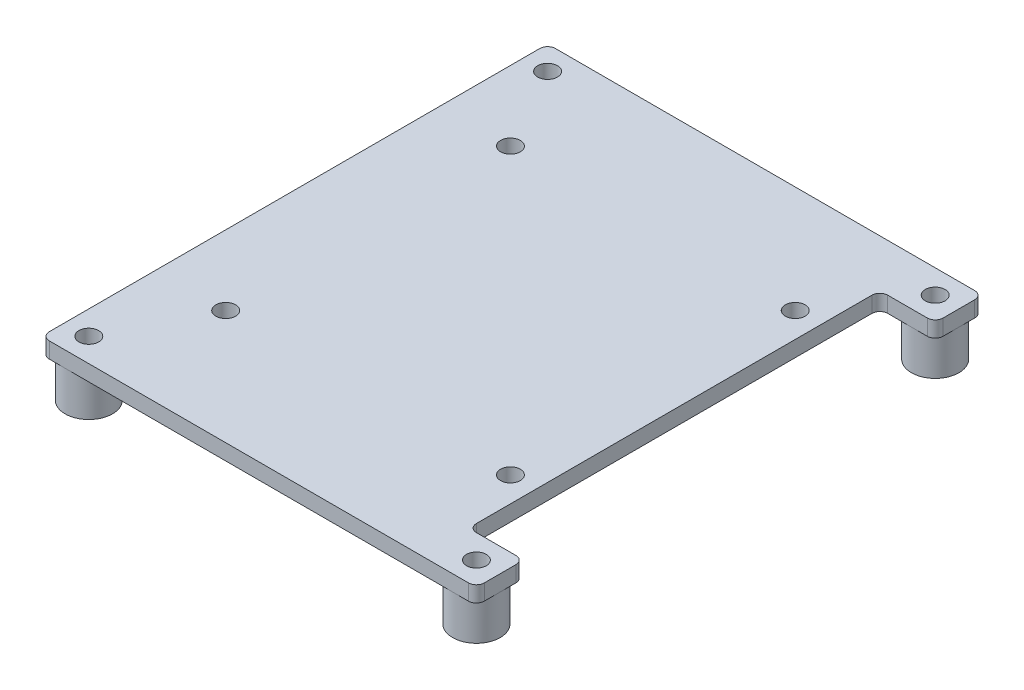
ISO-10303-21;
HEADER;
FILE_DESCRIPTION(('STEP AP214'),'2;1');
FILE_NAME('part.step','',(''),(''),'','','');
FILE_SCHEMA(('AUTOMOTIVE_DESIGN { 1 0 10303 214 1 1 1 1 }'));
ENDSEC;
DATA;
#1=APPLICATION_CONTEXT('core data for automotive mechanical design processes');
#2=APPLICATION_PROTOCOL_DEFINITION('international standard','automotive_design',2000,#1);
#3=PRODUCT_CONTEXT('',#1,'mechanical');
#4=PRODUCT('Part','Part','',(#3));
#5=PRODUCT_RELATED_PRODUCT_CATEGORY('part','',(#4));
#6=PRODUCT_DEFINITION_FORMATION('','',#4);
#7=PRODUCT_DEFINITION_CONTEXT('part definition',#1,'design');
#8=PRODUCT_DEFINITION('design','',#6,#7);
#9=PRODUCT_DEFINITION_SHAPE('','',#8);
#10=(LENGTH_UNIT() NAMED_UNIT(*) SI_UNIT(.MILLI.,.METRE.));
#11=(NAMED_UNIT(*) PLANE_ANGLE_UNIT() SI_UNIT($,.RADIAN.));
#12=(NAMED_UNIT(*) SI_UNIT($,.STERADIAN.) SOLID_ANGLE_UNIT());
#13=UNCERTAINTY_MEASURE_WITH_UNIT(LENGTH_MEASURE(1.E-05),#10,'distance_accuracy_value','');
#14=(GEOMETRIC_REPRESENTATION_CONTEXT(3) GLOBAL_UNCERTAINTY_ASSIGNED_CONTEXT((#13)) GLOBAL_UNIT_ASSIGNED_CONTEXT((#10,
#11,#12)) REPRESENTATION_CONTEXT('',''));
#15=CARTESIAN_POINT('',(0.,0.,0.));
#16=DIRECTION('',(0.,0.,1.));
#17=DIRECTION('',(1.,0.,0.));
#18=AXIS2_PLACEMENT_3D('',#15,#16,#17);
#19=CARTESIAN_POINT('',(0.,0.,0.));
#20=DIRECTION('',(0.,1.,0.));
#21=DIRECTION('',(0.,0.,1.));
#22=AXIS2_PLACEMENT_3D('',#19,#20,#21);
#23=PLANE('',#22);
#24=CARTESIAN_POINT('',(0.,0.,0.));
#25=DIRECTION('',(0.,1.,0.));
#26=DIRECTION('',(0.,0.,1.));
#27=AXIS2_PLACEMENT_3D('',#24,#25,#26);
#28=CIRCLE('',#27,1.249934);
#29=CARTESIAN_POINT('',(0.,0.,1.249934));
#30=VERTEX_POINT('',#29);
#31=EDGE_CURVE('E236',#30,#30,#28,.T.);
#32=ORIENTED_EDGE('',*,*,#31,.T.);
#33=EDGE_LOOP('',(#32));
#34=FACE_BOUND('',#33,.T.);
#35=CARTESIAN_POINT('',(35.999928,0.,0.));
#36=DIRECTION('',(0.,1.,0.));
#37=DIRECTION('',(0.,0.,1.));
#38=AXIS2_PLACEMENT_3D('',#35,#36,#37);
#39=CIRCLE('',#38,1.24993399999999);
#40=CARTESIAN_POINT('',(35.999928,0.,1.249934));
#41=VERTEX_POINT('',#40);
#42=EDGE_CURVE('E232',#41,#41,#39,.T.);
#43=ORIENTED_EDGE('',*,*,#42,.T.);
#44=EDGE_LOOP('',(#43));
#45=FACE_BOUND('',#44,.T.);
#46=CARTESIAN_POINT('',(0.,0.,35.999927999998));
#47=DIRECTION('',(0.,1.,0.));
#48=DIRECTION('',(0.,0.,1.));
#49=AXIS2_PLACEMENT_3D('',#46,#47,#48);
#50=CIRCLE('',#49,1.249934);
#51=CARTESIAN_POINT('',(0.,0.,37.249861999998));
#52=VERTEX_POINT('',#51);
#53=EDGE_CURVE('E228',#52,#52,#50,.T.);
#54=ORIENTED_EDGE('',*,*,#53,.T.);
#55=EDGE_LOOP('',(#54));
#56=FACE_BOUND('',#55,.T.);
#57=CARTESIAN_POINT('',(35.999928,0.,35.999927999998));
#58=DIRECTION('',(0.,1.,0.));
#59=DIRECTION('',(0.,0.,1.));
#60=AXIS2_PLACEMENT_3D('',#57,#58,#59);
#61=CIRCLE('',#60,1.249934);
#62=CARTESIAN_POINT('',(35.999928,0.,37.249861999998));
#63=VERTEX_POINT('',#62);
#64=EDGE_CURVE('E224',#63,#63,#61,.T.);
#65=ORIENTED_EDGE('',*,*,#64,.T.);
#66=EDGE_LOOP('',(#65));
#67=FACE_BOUND('',#66,.T.);
#68=DIRECTION('',(1.,0.,0.));
#69=VECTOR('',#68,1.);
#70=CARTESIAN_POINT('',(0.,0.,50.4711806944633));
#71=LINE('',#70,#69);
#72=CARTESIAN_POINT('',(-5.83017013155008,0.,50.4711806944633));
#73=VERTEX_POINT('',#72);
#74=CARTESIAN_POINT('',(43.1698298684499,0.,50.4711806944633));
#75=VERTEX_POINT('',#74);
#76=EDGE_CURVE('E62',#73,#75,#71,.T.);
#77=ORIENTED_EDGE('',*,*,#76,.F.);
#78=CARTESIAN_POINT('',(-5.83017013155008,0.,47.4711806944633));
#79=DIRECTION('',(0.,1.,0.));
#80=DIRECTION('',(0.,0.,1.));
#81=AXIS2_PLACEMENT_3D('',#78,#79,#80);
#82=CIRCLE('',#81,2.99999999999999);
#83=CARTESIAN_POINT('',(-8.83017013155007,0.,47.4711806944633));
#84=VERTEX_POINT('',#83);
#85=EDGE_CURVE('E11',#73,#84,#82,.T.);
#86=ORIENTED_EDGE('',*,*,#85,.T.);
#87=DIRECTION('',(0.,0.,1.));
#88=VECTOR('',#87,1.);
#89=CARTESIAN_POINT('',(-8.83017013155007,0.,0.));
#90=LINE('',#89,#88);
#91=CARTESIAN_POINT('',(-8.83017013155007,0.,-10.5288193055367));
#92=VERTEX_POINT('',#91);
#93=EDGE_CURVE('E191',#92,#84,#90,.T.);
#94=ORIENTED_EDGE('',*,*,#93,.F.);
#95=CARTESIAN_POINT('',(-5.83017013155007,0.,-10.5288193055367));
#96=DIRECTION('',(0.,1.,0.));
#97=DIRECTION('',(0.,0.,1.));
#98=AXIS2_PLACEMENT_3D('',#95,#96,#97);
#99=CIRCLE('',#98,3.);
#100=CARTESIAN_POINT('',(-5.83017013155007,0.,-13.5288193055367));
#101=VERTEX_POINT('',#100);
#102=EDGE_CURVE('E353',#92,#101,#99,.T.);
#103=ORIENTED_EDGE('',*,*,#102,.T.);
#104=DIRECTION('',(1.,0.,0.));
#105=VECTOR('',#104,1.);
#106=CARTESIAN_POINT('',(0.,0.,-13.5288193055367));
#107=LINE('',#106,#105);
#108=CARTESIAN_POINT('',(43.1698298684499,0.,-13.5288193055367));
#109=VERTEX_POINT('',#108);
#110=EDGE_CURVE('E536',#101,#109,#107,.T.);
#111=ORIENTED_EDGE('',*,*,#110,.T.);
#112=CARTESIAN_POINT('',(43.1698298684499,0.,-10.5288193055367));
#113=DIRECTION('',(0.,1.,0.));
#114=DIRECTION('',(0.,0.,1.));
#115=AXIS2_PLACEMENT_3D('',#112,#113,#114);
#116=CIRCLE('',#115,3.);
#117=CARTESIAN_POINT('',(43.1698298684499,0.,-7.52881930553675));
#118=VERTEX_POINT('',#117);
#119=EDGE_CURVE('E625',#109,#118,#116,.T.);
#120=ORIENTED_EDGE('',*,*,#119,.T.);
#121=DIRECTION('',(-1.,0.,0.));
#122=VECTOR('',#121,1.);
#123=CARTESIAN_POINT('',(46.1698298684499,0.,-7.52881930553675));
#124=LINE('',#123,#122);
#125=CARTESIAN_POINT('',(40.1698298684499,0.,-7.52881930553674));
#126=VERTEX_POINT('',#125);
#127=EDGE_CURVE('E551',#118,#126,#124,.T.);
#128=ORIENTED_EDGE('',*,*,#127,.T.);
#129=CARTESIAN_POINT('',(40.1698298684499,0.,-6.52881930553674));
#130=DIRECTION('',(0.,1.,0.));
#131=DIRECTION('',(0.,0.,1.));
#132=AXIS2_PLACEMENT_3D('',#129,#130,#131);
#133=CIRCLE('',#132,1.);
#134=CARTESIAN_POINT('',(39.1698298684499,0.,-6.52881930553674));
#135=VERTEX_POINT('',#134);
#136=EDGE_CURVE('E351',#126,#135,#133,.T.);
#137=ORIENTED_EDGE('',*,*,#136,.T.);
#138=DIRECTION('',(0.,0.,1.));
#139=VECTOR('',#138,1.);
#140=CARTESIAN_POINT('',(39.1698298684499,0.,-7.52881930553674));
#141=LINE('',#140,#139);
#142=CARTESIAN_POINT('',(39.1698298684499,0.,43.4711806944633));
#143=VERTEX_POINT('',#142);
#144=EDGE_CURVE('E527',#135,#143,#141,.T.);
#145=ORIENTED_EDGE('',*,*,#144,.T.);
#146=CARTESIAN_POINT('',(40.1698298684499,0.,43.4711806944633));
#147=DIRECTION('',(0.,1.,0.));
#148=DIRECTION('',(0.,0.,1.));
#149=AXIS2_PLACEMENT_3D('',#146,#147,#148);
#150=CIRCLE('',#149,1.);
#151=CARTESIAN_POINT('',(40.1698298684499,0.,44.4711806944633));
#152=VERTEX_POINT('',#151);
#153=EDGE_CURVE('E344',#143,#152,#150,.T.);
#154=ORIENTED_EDGE('',*,*,#153,.T.);
#155=DIRECTION('',(1.,0.,0.));
#156=VECTOR('',#155,1.);
#157=CARTESIAN_POINT('',(46.1698298684499,0.,44.4711806944633));
#158=LINE('',#157,#156);
#159=CARTESIAN_POINT('',(43.1698298684499,0.,44.4711806944633));
#160=VERTEX_POINT('',#159);
#161=EDGE_CURVE('E525',#152,#160,#158,.T.);
#162=ORIENTED_EDGE('',*,*,#161,.T.);
#163=CARTESIAN_POINT('',(43.1698298684499,0.,47.4711806944633));
#164=DIRECTION('',(0.,1.,0.));
#165=DIRECTION('',(0.,0.,1.));
#166=AXIS2_PLACEMENT_3D('',#163,#164,#165);
#167=CIRCLE('',#166,2.99999999999999);
#168=EDGE_CURVE('E607',#160,#75,#167,.T.);
#169=ORIENTED_EDGE('',*,*,#168,.T.);
#170=EDGE_LOOP('',(#77,#86,#94,#103,#111,#120,#128,#137,#145,#154,#162,#169));
#171=FACE_BOUND('',#170,.T.);
#172=ADVANCED_FACE('F41',(#34,#45,#56,#67,#171),#23,.F.);
#173=CARTESIAN_POINT('',(45.1698298684499,0.,50.4711806944633));
#174=VERTEX_POINT('',#173);
#175=EDGE_CURVE('E210',#75,#174,#71,.T.);
#176=ORIENTED_EDGE('',*,*,#175,.F.);
#177=CARTESIAN_POINT('',(46.1698298684499,0.,47.4711806944633));
#178=VERTEX_POINT('',#177);
#179=EDGE_CURVE('E438',#75,#178,#167,.T.);
#180=ORIENTED_EDGE('',*,*,#179,.T.);
#181=DIRECTION('',(0.,0.,1.));
#182=VECTOR('',#181,1.);
#183=CARTESIAN_POINT('',(46.1698298684499,0.,0.));
#184=LINE('',#183,#182);
#185=CARTESIAN_POINT('',(46.1698298684499,0.,49.4711806944633));
#186=VERTEX_POINT('',#185);
#187=EDGE_CURVE('E217',#178,#186,#184,.T.);
#188=ORIENTED_EDGE('',*,*,#187,.T.);
#189=CARTESIAN_POINT('',(45.1698298684499,0.,49.4711806944633));
#190=DIRECTION('',(0.,1.,0.));
#191=DIRECTION('',(0.,0.,1.));
#192=AXIS2_PLACEMENT_3D('',#189,#190,#191);
#193=CIRCLE('',#192,1.);
#194=EDGE_CURVE('E282',#186,#174,#193,.F.);
#195=ORIENTED_EDGE('',*,*,#194,.T.);
#196=EDGE_LOOP('',(#176,#180,#188,#195));
#197=FACE_BOUND('',#196,.T.);
#198=ADVANCED_FACE('F381',(#197),#23,.F.);
#199=CARTESIAN_POINT('',(46.1698298684499,0.,45.4711806944633));
#200=VERTEX_POINT('',#199);
#201=EDGE_CURVE('E218',#200,#178,#184,.T.);
#202=ORIENTED_EDGE('',*,*,#201,.T.);
#203=EDGE_CURVE('E616',#178,#160,#167,.T.);
#204=ORIENTED_EDGE('',*,*,#203,.T.);
#205=CARTESIAN_POINT('',(45.1698298684499,0.,44.4711806944633));
#206=VERTEX_POINT('',#205);
#207=EDGE_CURVE('E530',#160,#206,#158,.T.);
#208=ORIENTED_EDGE('',*,*,#207,.T.);
#209=CARTESIAN_POINT('',(45.1698298684499,0.,45.4711806944633));
#210=DIRECTION('',(0.,1.,0.));
#211=DIRECTION('',(0.,0.,1.));
#212=AXIS2_PLACEMENT_3D('',#209,#210,#211);
#213=CIRCLE('',#212,1.);
#214=EDGE_CURVE('E279',#206,#200,#213,.F.);
#215=ORIENTED_EDGE('',*,*,#214,.T.);
#216=EDGE_LOOP('',(#202,#204,#208,#215));
#217=FACE_BOUND('',#216,.T.);
#218=ADVANCED_FACE('F387',(#217),#23,.F.);
#219=CARTESIAN_POINT('',(45.1698298684499,0.,-7.52881930553675));
#220=VERTEX_POINT('',#219);
#221=EDGE_CURVE('E635',#220,#118,#124,.T.);
#222=ORIENTED_EDGE('',*,*,#221,.T.);
#223=CARTESIAN_POINT('',(46.1698298684499,0.,-10.5288193055367));
#224=VERTEX_POINT('',#223);
#225=EDGE_CURVE('E629',#118,#224,#116,.T.);
#226=ORIENTED_EDGE('',*,*,#225,.T.);
#227=CARTESIAN_POINT('',(46.1698298684499,0.,-8.52881930553674));
#228=VERTEX_POINT('',#227);
#229=EDGE_CURVE('E222',#224,#228,#184,.T.);
#230=ORIENTED_EDGE('',*,*,#229,.T.);
#231=CARTESIAN_POINT('',(45.1698298684499,0.,-8.52881930553674));
#232=DIRECTION('',(0.,1.,0.));
#233=DIRECTION('',(0.,0.,1.));
#234=AXIS2_PLACEMENT_3D('',#231,#232,#233);
#235=CIRCLE('',#234,1.);
#236=EDGE_CURVE('E294',#228,#220,#235,.F.);
#237=ORIENTED_EDGE('',*,*,#236,.T.);
#238=EDGE_LOOP('',(#222,#226,#230,#237));
#239=FACE_BOUND('',#238,.T.);
#240=ADVANCED_FACE('F414',(#239),#23,.F.);
#241=CARTESIAN_POINT('',(46.1698298684499,0.,-12.5288193055367));
#242=VERTEX_POINT('',#241);
#243=EDGE_CURVE('E223',#242,#224,#184,.T.);
#244=ORIENTED_EDGE('',*,*,#243,.T.);
#245=EDGE_CURVE('E423',#224,#109,#116,.T.);
#246=ORIENTED_EDGE('',*,*,#245,.T.);
#247=CARTESIAN_POINT('',(45.1698298684499,0.,-13.5288193055367));
#248=VERTEX_POINT('',#247);
#249=EDGE_CURVE('E532',#109,#248,#107,.T.);
#250=ORIENTED_EDGE('',*,*,#249,.T.);
#251=CARTESIAN_POINT('',(45.1698298684499,0.,-12.5288193055367));
#252=DIRECTION('',(0.,1.,0.));
#253=DIRECTION('',(0.,0.,1.));
#254=AXIS2_PLACEMENT_3D('',#251,#252,#253);
#255=CIRCLE('',#254,1.);
#256=EDGE_CURVE('E291',#248,#242,#255,.F.);
#257=ORIENTED_EDGE('',*,*,#256,.T.);
#258=EDGE_LOOP('',(#244,#246,#250,#257));
#259=FACE_BOUND('',#258,.T.);
#260=ADVANCED_FACE('F405',(#259),#23,.F.);
#261=CARTESIAN_POINT('',(-7.83017013155007,0.,-13.5288193055367));
#262=VERTEX_POINT('',#261);
#263=EDGE_CURVE('E202',#262,#101,#107,.T.);
#264=ORIENTED_EDGE('',*,*,#263,.T.);
#265=EDGE_CURVE('E186',#101,#92,#99,.T.);
#266=ORIENTED_EDGE('',*,*,#265,.T.);
#267=CARTESIAN_POINT('',(-8.83017013155007,0.,-12.5288193055367));
#268=VERTEX_POINT('',#267);
#269=EDGE_CURVE('E204',#268,#92,#90,.T.);
#270=ORIENTED_EDGE('',*,*,#269,.F.);
#271=CARTESIAN_POINT('',(-7.83017013155007,0.,-12.5288193055367));
#272=DIRECTION('',(0.,1.,0.));
#273=DIRECTION('',(0.,0.,1.));
#274=AXIS2_PLACEMENT_3D('',#271,#272,#273);
#275=CIRCLE('',#274,1.);
#276=EDGE_CURVE('E288',#268,#262,#275,.F.);
#277=ORIENTED_EDGE('',*,*,#276,.T.);
#278=EDGE_LOOP('',(#264,#266,#270,#277));
#279=FACE_BOUND('',#278,.T.);
#280=ADVANCED_FACE('F361',(#279),#23,.F.);
#281=CARTESIAN_POINT('',(46.1698298684499,2.,0.));
#282=DIRECTION('',(1.,0.,0.));
#283=DIRECTION('',(0.,0.,-1.));
#284=AXIS2_PLACEMENT_3D('',#281,#282,#283);
#285=PLANE('',#284);
#286=DIRECTION('',(0.,0.,1.));
#287=VECTOR('',#286,1.);
#288=CARTESIAN_POINT('',(46.1698298684499,2.,0.));
#289=LINE('',#288,#287);
#290=CARTESIAN_POINT('',(46.1698298684499,2.,45.4711806944633));
#291=VERTEX_POINT('',#290);
#292=CARTESIAN_POINT('',(46.1698298684499,2.,49.4711806944633));
#293=VERTEX_POINT('',#292);
#294=EDGE_CURVE('E445',#291,#293,#289,.T.);
#295=ORIENTED_EDGE('',*,*,#294,.T.);
#296=DIRECTION('',(0.,-1.,0.));
#297=VECTOR('',#296,1.);
#298=CARTESIAN_POINT('',(46.1698298684499,0.,49.4711806944633));
#299=LINE('',#298,#297);
#300=EDGE_CURVE('E322',#293,#186,#299,.T.);
#301=ORIENTED_EDGE('',*,*,#300,.T.);
#302=ORIENTED_EDGE('',*,*,#187,.F.);
#303=ORIENTED_EDGE('',*,*,#201,.F.);
#304=DIRECTION('',(0.,1.,0.));
#305=VECTOR('',#304,1.);
#306=CARTESIAN_POINT('',(46.1698298684499,2.,45.4711806944633));
#307=LINE('',#306,#305);
#308=EDGE_CURVE('E318',#200,#291,#307,.T.);
#309=ORIENTED_EDGE('',*,*,#308,.T.);
#310=EDGE_LOOP('',(#295,#301,#302,#303,#309));
#311=FACE_BOUND('',#310,.T.);
#312=ADVANCED_FACE('F404',(#311),#285,.T.);
#313=CARTESIAN_POINT('',(0.,2.,-13.5288193055367));
#314=DIRECTION('',(0.,0.,-1.));
#315=DIRECTION('',(-1.,0.,0.));
#316=AXIS2_PLACEMENT_3D('',#313,#314,#315);
#317=PLANE('',#316);
#318=DIRECTION('',(1.,0.,0.));
#319=VECTOR('',#318,1.);
#320=CARTESIAN_POINT('',(0.,2.,-13.5288193055367));
#321=LINE('',#320,#319);
#322=CARTESIAN_POINT('',(-7.83017013155007,2.,-13.5288193055367));
#323=VERTEX_POINT('',#322);
#324=CARTESIAN_POINT('',(45.1698298684499,2.,-13.5288193055367));
#325=VERTEX_POINT('',#324);
#326=EDGE_CURVE('E567',#323,#325,#321,.T.);
#327=ORIENTED_EDGE('',*,*,#326,.T.);
#328=DIRECTION('',(0.,-1.,0.));
#329=VECTOR('',#328,1.);
#330=CARTESIAN_POINT('',(45.1698298684499,2.,-13.5288193055367));
#331=LINE('',#330,#329);
#332=EDGE_CURVE('E300',#325,#248,#331,.T.);
#333=ORIENTED_EDGE('',*,*,#332,.T.);
#334=ORIENTED_EDGE('',*,*,#249,.F.);
#335=ORIENTED_EDGE('',*,*,#110,.F.);
#336=ORIENTED_EDGE('',*,*,#263,.F.);
#337=DIRECTION('',(0.,-1.,0.));
#338=VECTOR('',#337,1.);
#339=CARTESIAN_POINT('',(-7.83017013155007,2.,-13.5288193055367));
#340=LINE('',#339,#338);
#341=EDGE_CURVE('E297',#262,#323,#340,.F.);
#342=ORIENTED_EDGE('',*,*,#341,.T.);
#343=EDGE_LOOP('',(#327,#333,#334,#335,#336,#342));
#344=FACE_BOUND('',#343,.T.);
#345=ADVANCED_FACE('F410',(#344),#317,.T.);
#346=CARTESIAN_POINT('',(-8.83017013155007,2.,0.));
#347=DIRECTION('',(1.,0.,0.));
#348=DIRECTION('',(0.,0.,-1.));
#349=AXIS2_PLACEMENT_3D('',#346,#347,#348);
#350=PLANE('',#349);
#351=ORIENTED_EDGE('',*,*,#93,.T.);
#352=CARTESIAN_POINT('',(-8.83017013155007,0.,49.4711806944633));
#353=VERTEX_POINT('',#352);
#354=EDGE_CURVE('E195',#84,#353,#90,.T.);
#355=ORIENTED_EDGE('',*,*,#354,.T.);
#356=DIRECTION('',(0.,-1.,0.));
#357=VECTOR('',#356,1.);
#358=CARTESIAN_POINT('',(-8.83017013155007,2.,49.4711806944633));
#359=LINE('',#358,#357);
#360=CARTESIAN_POINT('',(-8.83017013155007,2.,49.4711806944633));
#361=VERTEX_POINT('',#360);
#362=EDGE_CURVE('E304',#353,#361,#359,.F.);
#363=ORIENTED_EDGE('',*,*,#362,.T.);
#364=DIRECTION('',(0.,0.,1.));
#365=VECTOR('',#364,1.);
#366=CARTESIAN_POINT('',(-8.83017013155007,2.,0.));
#367=LINE('',#366,#365);
#368=CARTESIAN_POINT('',(-8.83017013155007,2.,-12.5288193055367));
#369=VERTEX_POINT('',#368);
#370=EDGE_CURVE('E456',#369,#361,#367,.T.);
#371=ORIENTED_EDGE('',*,*,#370,.F.);
#372=DIRECTION('',(0.,-1.,0.));
#373=VECTOR('',#372,1.);
#374=CARTESIAN_POINT('',(-8.83017013155007,0.,-12.5288193055367));
#375=LINE('',#374,#373);
#376=EDGE_CURVE('E307',#369,#268,#375,.T.);
#377=ORIENTED_EDGE('',*,*,#376,.T.);
#378=ORIENTED_EDGE('',*,*,#269,.T.);
#379=EDGE_LOOP('',(#351,#355,#363,#371,#377,#378));
#380=FACE_BOUND('',#379,.T.);
#381=ADVANCED_FACE('F205',(#380),#350,.F.);
#382=CARTESIAN_POINT('',(0.,2.,50.4711806944633));
#383=DIRECTION('',(0.,0.,-1.));
#384=DIRECTION('',(-1.,0.,0.));
#385=AXIS2_PLACEMENT_3D('',#382,#383,#384);
#386=PLANE('',#385);
#387=CARTESIAN_POINT('',(-7.83017013155007,0.,50.4711806944633));
#388=VERTEX_POINT('',#387);
#389=EDGE_CURVE('E214',#388,#73,#71,.T.);
#390=ORIENTED_EDGE('',*,*,#389,.T.);
#391=ORIENTED_EDGE('',*,*,#76,.T.);
#392=ORIENTED_EDGE('',*,*,#175,.T.);
#393=DIRECTION('',(0.,-1.,0.));
#394=VECTOR('',#393,1.);
#395=CARTESIAN_POINT('',(45.1698298684499,2.,50.4711806944633));
#396=LINE('',#395,#394);
#397=CARTESIAN_POINT('',(45.1698298684499,2.,50.4711806944633));
#398=VERTEX_POINT('',#397);
#399=EDGE_CURVE('E310',#174,#398,#396,.F.);
#400=ORIENTED_EDGE('',*,*,#399,.T.);
#401=DIRECTION('',(1.,0.,0.));
#402=VECTOR('',#401,1.);
#403=CARTESIAN_POINT('',(0.,2.,50.4711806944633));
#404=LINE('',#403,#402);
#405=CARTESIAN_POINT('',(-7.83017013155007,2.,50.4711806944633));
#406=VERTEX_POINT('',#405);
#407=EDGE_CURVE('E449',#406,#398,#404,.T.);
#408=ORIENTED_EDGE('',*,*,#407,.F.);
#409=DIRECTION('',(0.,-1.,0.));
#410=VECTOR('',#409,1.);
#411=CARTESIAN_POINT('',(-7.83017013155007,2.,50.4711806944633));
#412=LINE('',#411,#410);
#413=EDGE_CURVE('E314',#406,#388,#412,.T.);
#414=ORIENTED_EDGE('',*,*,#413,.T.);
#415=EDGE_LOOP('',(#390,#391,#392,#400,#408,#414));
#416=FACE_BOUND('',#415,.T.);
#417=ADVANCED_FACE('F458',(#416),#386,.F.);
#418=CARTESIAN_POINT('',(35.999928,2.,0.));
#419=DIRECTION('',(0.,-1.,0.));
#420=DIRECTION('',(0.,0.,-1.));
#421=AXIS2_PLACEMENT_3D('',#418,#419,#420);
#422=CYLINDRICAL_SURFACE('',#421,1.24993399999999);
#423=CARTESIAN_POINT('',(35.999928,2.,0.));
#424=DIRECTION('',(0.,1.,0.));
#425=DIRECTION('',(0.,0.,1.));
#426=AXIS2_PLACEMENT_3D('',#423,#424,#425);
#427=CIRCLE('',#426,1.24993399999999);
#428=CARTESIAN_POINT('',(35.999928,2.,1.249934));
#429=VERTEX_POINT('',#428);
#430=EDGE_CURVE('E580',#429,#429,#427,.T.);
#431=ORIENTED_EDGE('',*,*,#430,.T.);
#432=EDGE_LOOP('',(#431));
#433=FACE_BOUND('',#432,.T.);
#434=ORIENTED_EDGE('',*,*,#42,.F.);
#435=EDGE_LOOP('',(#434));
#436=FACE_BOUND('',#435,.T.);
#437=ADVANCED_FACE('F462',(#433,#436),#422,.F.);
#438=CARTESIAN_POINT('',(0.,2.,35.999927999998));
#439=DIRECTION('',(0.,-1.,0.));
#440=DIRECTION('',(0.,0.,-1.));
#441=AXIS2_PLACEMENT_3D('',#438,#439,#440);
#442=CYLINDRICAL_SURFACE('',#441,1.249934);
#443=CARTESIAN_POINT('',(0.,2.,35.999927999998));
#444=DIRECTION('',(0.,1.,0.));
#445=DIRECTION('',(0.,0.,1.));
#446=AXIS2_PLACEMENT_3D('',#443,#444,#445);
#447=CIRCLE('',#446,1.249934);
#448=CARTESIAN_POINT('',(0.,2.,37.249861999998));
#449=VERTEX_POINT('',#448);
#450=EDGE_CURVE('E576',#449,#449,#447,.T.);
#451=ORIENTED_EDGE('',*,*,#450,.T.);
#452=EDGE_LOOP('',(#451));
#453=FACE_BOUND('',#452,.T.);
#454=ORIENTED_EDGE('',*,*,#53,.F.);
#455=EDGE_LOOP('',(#454));
#456=FACE_BOUND('',#455,.T.);
#457=ADVANCED_FACE('F468',(#453,#456),#442,.F.);
#458=CARTESIAN_POINT('',(35.999928,2.,35.999927999998));
#459=DIRECTION('',(0.,-1.,0.));
#460=DIRECTION('',(0.,0.,-1.));
#461=AXIS2_PLACEMENT_3D('',#458,#459,#460);
#462=CYLINDRICAL_SURFACE('',#461,1.249934);
#463=CARTESIAN_POINT('',(35.999928,2.,35.999927999998));
#464=DIRECTION('',(0.,1.,0.));
#465=DIRECTION('',(0.,0.,1.));
#466=AXIS2_PLACEMENT_3D('',#463,#464,#465);
#467=CIRCLE('',#466,1.249934);
#468=CARTESIAN_POINT('',(35.999928,2.,37.249861999998));
#469=VERTEX_POINT('',#468);
#470=EDGE_CURVE('E572',#469,#469,#467,.T.);
#471=ORIENTED_EDGE('',*,*,#470,.T.);
#472=EDGE_LOOP('',(#471));
#473=FACE_BOUND('',#472,.T.);
#474=ORIENTED_EDGE('',*,*,#64,.F.);
#475=EDGE_LOOP('',(#474));
#476=FACE_BOUND('',#475,.T.);
#477=ADVANCED_FACE('F674',(#473,#476),#462,.F.);
#478=CARTESIAN_POINT('',(46.1698298684499,2.,-12.5288193055367));
#479=VERTEX_POINT('',#478);
#480=CARTESIAN_POINT('',(46.1698298684499,2.,-8.52881930553674));
#481=VERTEX_POINT('',#480);
#482=EDGE_CURVE('E448',#479,#481,#289,.T.);
#483=ORIENTED_EDGE('',*,*,#482,.T.);
#484=DIRECTION('',(0.,1.,0.));
#485=VECTOR('',#484,1.);
#486=CARTESIAN_POINT('',(46.1698298684499,0.,-8.52881930553674));
#487=LINE('',#486,#485);
#488=EDGE_CURVE('E275',#481,#228,#487,.F.);
#489=ORIENTED_EDGE('',*,*,#488,.T.);
#490=ORIENTED_EDGE('',*,*,#229,.F.);
#491=ORIENTED_EDGE('',*,*,#243,.F.);
#492=DIRECTION('',(0.,-1.,0.));
#493=VECTOR('',#492,1.);
#494=CARTESIAN_POINT('',(46.1698298684499,2.,-12.5288193055367));
#495=LINE('',#494,#493);
#496=EDGE_CURVE('E272',#242,#479,#495,.F.);
#497=ORIENTED_EDGE('',*,*,#496,.T.);
#498=EDGE_LOOP('',(#483,#489,#490,#491,#497));
#499=FACE_BOUND('',#498,.T.);
#500=ADVANCED_FACE('F413',(#499),#285,.T.);
#501=CARTESIAN_POINT('',(-5.83017013155008,2.,47.4711806944633));
#502=DIRECTION('',(0.,-1.,0.));
#503=DIRECTION('',(0.,0.,-1.));
#504=AXIS2_PLACEMENT_3D('',#501,#502,#503);
#505=CYLINDRICAL_SURFACE('',#504,1.25);
#506=CARTESIAN_POINT('',(-5.83017013155008,2.,47.4711806944633));
#507=DIRECTION('',(0.,1.,0.));
#508=DIRECTION('',(0.,0.,1.));
#509=AXIS2_PLACEMENT_3D('',#506,#507,#508);
#510=CIRCLE('',#509,1.25);
#511=CARTESIAN_POINT('',(-5.83017013155008,2.,48.7211806944633));
#512=VERTEX_POINT('',#511);
#513=EDGE_CURVE('E563',#512,#512,#510,.T.);
#514=ORIENTED_EDGE('',*,*,#513,.T.);
#515=EDGE_LOOP('',(#514));
#516=FACE_BOUND('',#515,.T.);
#517=CARTESIAN_POINT('',(-5.83017013155008,-5.,47.4711806944633));
#518=DIRECTION('',(0.,1.,0.));
#519=DIRECTION('',(0.,0.,1.));
#520=AXIS2_PLACEMENT_3D('',#517,#518,#519);
#521=CIRCLE('',#520,1.25);
#522=CARTESIAN_POINT('',(-5.83017013155008,-5.,48.7211806944633));
#523=VERTEX_POINT('',#522);
#524=EDGE_CURVE('E610',#523,#523,#521,.T.);
#525=ORIENTED_EDGE('',*,*,#524,.F.);
#526=EDGE_LOOP('',(#525));
#527=FACE_BOUND('',#526,.T.);
#528=ADVANCED_FACE('F477',(#516,#527),#505,.F.);
#529=CARTESIAN_POINT('',(-5.83017013155007,2.,-10.5288193055367));
#530=DIRECTION('',(0.,-1.,0.));
#531=DIRECTION('',(0.,0.,-1.));
#532=AXIS2_PLACEMENT_3D('',#529,#530,#531);
#533=CYLINDRICAL_SURFACE('',#532,1.25);
#534=CARTESIAN_POINT('',(-5.83017013155007,2.,-10.5288193055367));
#535=DIRECTION('',(0.,1.,0.));
#536=DIRECTION('',(0.,0.,1.));
#537=AXIS2_PLACEMENT_3D('',#534,#535,#536);
#538=CIRCLE('',#537,1.25);
#539=CARTESIAN_POINT('',(-5.83017013155007,2.,-9.27881930553674));
#540=VERTEX_POINT('',#539);
#541=EDGE_CURVE('E559',#540,#540,#538,.T.);
#542=ORIENTED_EDGE('',*,*,#541,.T.);
#543=EDGE_LOOP('',(#542));
#544=FACE_BOUND('',#543,.T.);
#545=CARTESIAN_POINT('',(-5.83017013155007,-5.,-10.5288193055367));
#546=DIRECTION('',(0.,1.,0.));
#547=DIRECTION('',(0.,0.,1.));
#548=AXIS2_PLACEMENT_3D('',#545,#546,#547);
#549=CIRCLE('',#548,1.25);
#550=CARTESIAN_POINT('',(-5.83017013155007,-5.,-9.27881930553674));
#551=VERTEX_POINT('',#550);
#552=EDGE_CURVE('E630',#551,#551,#549,.T.);
#553=ORIENTED_EDGE('',*,*,#552,.F.);
#554=EDGE_LOOP('',(#553));
#555=FACE_BOUND('',#554,.T.);
#556=ADVANCED_FACE('F480',(#544,#555),#533,.F.);
#557=CARTESIAN_POINT('',(43.1698298684499,2.,47.4711806944633));
#558=DIRECTION('',(0.,-1.,0.));
#559=DIRECTION('',(0.,0.,-1.));
#560=AXIS2_PLACEMENT_3D('',#557,#558,#559);
#561=CYLINDRICAL_SURFACE('',#560,1.24999999999999);
#562=CARTESIAN_POINT('',(43.1698298684499,2.,47.4711806944633));
#563=DIRECTION('',(0.,1.,0.));
#564=DIRECTION('',(0.,0.,1.));
#565=AXIS2_PLACEMENT_3D('',#562,#563,#564);
#566=CIRCLE('',#565,1.24999999999999);
#567=CARTESIAN_POINT('',(43.1698298684499,2.,48.7211806944633));
#568=VERTEX_POINT('',#567);
#569=EDGE_CURVE('E555',#568,#568,#566,.T.);
#570=ORIENTED_EDGE('',*,*,#569,.T.);
#571=EDGE_LOOP('',(#570));
#572=FACE_BOUND('',#571,.T.);
#573=CARTESIAN_POINT('',(43.1698298684499,-5.,47.4711806944633));
#574=DIRECTION('',(0.,1.,0.));
#575=DIRECTION('',(0.,0.,1.));
#576=AXIS2_PLACEMENT_3D('',#573,#574,#575);
#577=CIRCLE('',#576,1.25);
#578=CARTESIAN_POINT('',(43.1698298684499,-5.,48.7211806944633));
#579=VERTEX_POINT('',#578);
#580=EDGE_CURVE('E598',#579,#579,#577,.T.);
#581=ORIENTED_EDGE('',*,*,#580,.F.);
#582=EDGE_LOOP('',(#581));
#583=FACE_BOUND('',#582,.T.);
#584=ADVANCED_FACE('F484',(#572,#583),#561,.F.);
#585=CARTESIAN_POINT('',(43.1698298684499,2.,-10.5288193055367));
#586=DIRECTION('',(0.,-1.,0.));
#587=DIRECTION('',(0.,0.,-1.));
#588=AXIS2_PLACEMENT_3D('',#585,#586,#587);
#589=CYLINDRICAL_SURFACE('',#588,1.25000000000001);
#590=CARTESIAN_POINT('',(43.1698298684499,2.,-10.5288193055367));
#591=DIRECTION('',(0.,1.,0.));
#592=DIRECTION('',(0.,0.,1.));
#593=AXIS2_PLACEMENT_3D('',#590,#591,#592);
#594=CIRCLE('',#593,1.25000000000001);
#595=CARTESIAN_POINT('',(43.1698298684499,2.,-9.27881930553674));
#596=VERTEX_POINT('',#595);
#597=EDGE_CURVE('E240',#596,#596,#594,.T.);
#598=ORIENTED_EDGE('',*,*,#597,.T.);
#599=EDGE_LOOP('',(#598));
#600=FACE_BOUND('',#599,.T.);
#601=CARTESIAN_POINT('',(43.1698298684499,-5.,-10.5288193055367));
#602=DIRECTION('',(0.,1.,0.));
#603=DIRECTION('',(0.,0.,1.));
#604=AXIS2_PLACEMENT_3D('',#601,#602,#603);
#605=CIRCLE('',#604,1.25000000000001);
#606=CARTESIAN_POINT('',(43.1698298684499,-5.,-9.27881930553674));
#607=VERTEX_POINT('',#606);
#608=EDGE_CURVE('E617',#607,#607,#605,.T.);
#609=ORIENTED_EDGE('',*,*,#608,.F.);
#610=EDGE_LOOP('',(#609));
#611=FACE_BOUND('',#610,.T.);
#612=ADVANCED_FACE('F488',(#600,#611),#589,.F.);
#613=CARTESIAN_POINT('',(0.,2.,0.));
#614=DIRECTION('',(0.,-1.,0.));
#615=DIRECTION('',(0.,0.,-1.));
#616=AXIS2_PLACEMENT_3D('',#613,#614,#615);
#617=CYLINDRICAL_SURFACE('',#616,1.249934);
#618=CARTESIAN_POINT('',(0.,2.,0.));
#619=DIRECTION('',(0.,1.,0.));
#620=DIRECTION('',(0.,0.,1.));
#621=AXIS2_PLACEMENT_3D('',#618,#619,#620);
#622=CIRCLE('',#621,1.249934);
#623=CARTESIAN_POINT('',(0.,2.,1.249934));
#624=VERTEX_POINT('',#623);
#625=EDGE_CURVE('E246',#624,#624,#622,.T.);
#626=ORIENTED_EDGE('',*,*,#625,.T.);
#627=EDGE_LOOP('',(#626));
#628=FACE_BOUND('',#627,.T.);
#629=ORIENTED_EDGE('',*,*,#31,.F.);
#630=EDGE_LOOP('',(#629));
#631=FACE_BOUND('',#630,.T.);
#632=ADVANCED_FACE('F401',(#628,#631),#617,.F.);
#633=CARTESIAN_POINT('',(0.,2.,0.));
#634=DIRECTION('',(0.,1.,0.));
#635=DIRECTION('',(0.,0.,1.));
#636=AXIS2_PLACEMENT_3D('',#633,#634,#635);
#637=PLANE('',#636);
#638=ORIENTED_EDGE('',*,*,#407,.T.);
#639=CARTESIAN_POINT('',(45.1698298684499,2.,49.4711806944633));
#640=DIRECTION('',(0.,1.,0.));
#641=DIRECTION('',(0.,0.,1.));
#642=AXIS2_PLACEMENT_3D('',#639,#640,#641);
#643=CIRCLE('',#642,1.);
#644=EDGE_CURVE('E254',#398,#293,#643,.T.);
#645=ORIENTED_EDGE('',*,*,#644,.T.);
#646=ORIENTED_EDGE('',*,*,#294,.F.);
#647=CARTESIAN_POINT('',(45.1698298684499,2.,45.4711806944633));
#648=DIRECTION('',(0.,1.,0.));
#649=DIRECTION('',(0.,0.,1.));
#650=AXIS2_PLACEMENT_3D('',#647,#648,#649);
#651=CIRCLE('',#650,1.);
#652=CARTESIAN_POINT('',(45.1698298684499,2.,44.4711806944633));
#653=VERTEX_POINT('',#652);
#654=EDGE_CURVE('E250',#291,#653,#651,.T.);
#655=ORIENTED_EDGE('',*,*,#654,.T.);
#656=DIRECTION('',(1.,0.,0.));
#657=VECTOR('',#656,1.);
#658=CARTESIAN_POINT('',(46.1698298684499,2.,44.4711806944633));
#659=LINE('',#658,#657);
#660=CARTESIAN_POINT('',(40.1698298684499,2.,44.4711806944633));
#661=VERTEX_POINT('',#660);
#662=EDGE_CURVE('E548',#661,#653,#659,.T.);
#663=ORIENTED_EDGE('',*,*,#662,.F.);
#664=CARTESIAN_POINT('',(40.1698298684499,2.,43.4711806944633));
#665=DIRECTION('',(0.,1.,0.));
#666=DIRECTION('',(0.,0.,1.));
#667=AXIS2_PLACEMENT_3D('',#664,#665,#666);
#668=CIRCLE('',#667,1.);
#669=CARTESIAN_POINT('',(39.1698298684499,2.,43.4711806944633));
#670=VERTEX_POINT('',#669);
#671=EDGE_CURVE('E341',#661,#670,#668,.F.);
#672=ORIENTED_EDGE('',*,*,#671,.T.);
#673=DIRECTION('',(0.,0.,1.));
#674=VECTOR('',#673,1.);
#675=CARTESIAN_POINT('',(39.1698298684499,2.,-7.52881930553674));
#676=LINE('',#675,#674);
#677=CARTESIAN_POINT('',(39.1698298684499,2.,-6.52881930553674));
#678=VERTEX_POINT('',#677);
#679=EDGE_CURVE('E543',#678,#670,#676,.T.);
#680=ORIENTED_EDGE('',*,*,#679,.F.);
#681=CARTESIAN_POINT('',(40.1698298684499,2.,-6.52881930553674));
#682=DIRECTION('',(0.,1.,0.));
#683=DIRECTION('',(0.,0.,1.));
#684=AXIS2_PLACEMENT_3D('',#681,#682,#683);
#685=CIRCLE('',#684,1.);
#686=CARTESIAN_POINT('',(40.1698298684499,2.,-7.52881930553674));
#687=VERTEX_POINT('',#686);
#688=EDGE_CURVE('E347',#678,#687,#685,.F.);
#689=ORIENTED_EDGE('',*,*,#688,.T.);
#690=DIRECTION('',(-1.,0.,0.));
#691=VECTOR('',#690,1.);
#692=CARTESIAN_POINT('',(46.1698298684499,2.,-7.52881930553675));
#693=LINE('',#692,#691);
#694=CARTESIAN_POINT('',(45.1698298684499,2.,-7.52881930553675));
#695=VERTEX_POINT('',#694);
#696=EDGE_CURVE('E540',#695,#687,#693,.T.);
#697=ORIENTED_EDGE('',*,*,#696,.F.);
#698=CARTESIAN_POINT('',(45.1698298684499,2.,-8.52881930553674));
#699=DIRECTION('',(0.,1.,0.));
#700=DIRECTION('',(0.,0.,1.));
#701=AXIS2_PLACEMENT_3D('',#698,#699,#700);
#702=CIRCLE('',#701,1.);
#703=EDGE_CURVE('E268',#695,#481,#702,.T.);
#704=ORIENTED_EDGE('',*,*,#703,.T.);
#705=ORIENTED_EDGE('',*,*,#482,.F.);
#706=CARTESIAN_POINT('',(45.1698298684499,2.,-12.5288193055367));
#707=DIRECTION('',(0.,1.,0.));
#708=DIRECTION('',(0.,0.,1.));
#709=AXIS2_PLACEMENT_3D('',#706,#707,#708);
#710=CIRCLE('',#709,1.);
#711=EDGE_CURVE('E264',#479,#325,#710,.T.);
#712=ORIENTED_EDGE('',*,*,#711,.T.);
#713=ORIENTED_EDGE('',*,*,#326,.F.);
#714=CARTESIAN_POINT('',(-7.83017013155007,2.,-12.5288193055367));
#715=DIRECTION('',(0.,1.,0.));
#716=DIRECTION('',(0.,0.,1.));
#717=AXIS2_PLACEMENT_3D('',#714,#715,#716);
#718=CIRCLE('',#717,1.);
#719=EDGE_CURVE('E261',#323,#369,#718,.T.);
#720=ORIENTED_EDGE('',*,*,#719,.T.);
#721=ORIENTED_EDGE('',*,*,#370,.T.);
#722=CARTESIAN_POINT('',(-7.83017013155007,2.,49.4711806944633));
#723=DIRECTION('',(0.,1.,0.));
#724=DIRECTION('',(0.,0.,1.));
#725=AXIS2_PLACEMENT_3D('',#722,#723,#724);
#726=CIRCLE('',#725,1.);
#727=EDGE_CURVE('E258',#361,#406,#726,.T.);
#728=ORIENTED_EDGE('',*,*,#727,.T.);
#729=EDGE_LOOP('',(#638,#645,#646,#655,#663,#672,#680,#689,#697,#704,#705,#712,#713,#720,#721,#728));
#730=FACE_BOUND('',#729,.T.);
#731=ORIENTED_EDGE('',*,*,#513,.F.);
#732=EDGE_LOOP('',(#731));
#733=FACE_BOUND('',#732,.T.);
#734=ORIENTED_EDGE('',*,*,#470,.F.);
#735=EDGE_LOOP('',(#734));
#736=FACE_BOUND('',#735,.T.);
#737=ORIENTED_EDGE('',*,*,#450,.F.);
#738=EDGE_LOOP('',(#737));
#739=FACE_BOUND('',#738,.T.);
#740=ORIENTED_EDGE('',*,*,#430,.F.);
#741=EDGE_LOOP('',(#740));
#742=FACE_BOUND('',#741,.T.);
#743=ORIENTED_EDGE('',*,*,#625,.F.);
#744=EDGE_LOOP('',(#743));
#745=FACE_BOUND('',#744,.T.);
#746=ORIENTED_EDGE('',*,*,#541,.F.);
#747=EDGE_LOOP('',(#746));
#748=FACE_BOUND('',#747,.T.);
#749=ORIENTED_EDGE('',*,*,#597,.F.);
#750=EDGE_LOOP('',(#749));
#751=FACE_BOUND('',#750,.T.);
#752=ORIENTED_EDGE('',*,*,#569,.F.);
#753=EDGE_LOOP('',(#752));
#754=FACE_BOUND('',#753,.T.);
#755=ADVANCED_FACE('F394',(#730,#733,#736,#739,#742,#745,#748,#751,#754),#637,.T.);
#756=ORIENTED_EDGE('',*,*,#354,.F.);
#757=EDGE_CURVE('E45',#84,#73,#82,.T.);
#758=ORIENTED_EDGE('',*,*,#757,.T.);
#759=ORIENTED_EDGE('',*,*,#389,.F.);
#760=CARTESIAN_POINT('',(-7.83017013155007,0.,49.4711806944633));
#761=DIRECTION('',(0.,1.,0.));
#762=DIRECTION('',(0.,0.,1.));
#763=AXIS2_PLACEMENT_3D('',#760,#761,#762);
#764=CIRCLE('',#763,1.);
#765=EDGE_CURVE('E197',#388,#353,#764,.F.);
#766=ORIENTED_EDGE('',*,*,#765,.T.);
#767=EDGE_LOOP('',(#756,#758,#759,#766));
#768=FACE_BOUND('',#767,.T.);
#769=ADVANCED_FACE('F196',(#768),#23,.F.);
#770=CARTESIAN_POINT('',(46.1698298684499,0.,44.4711806944633));
#771=DIRECTION('',(0.,0.,1.));
#772=DIRECTION('',(1.,0.,0.));
#773=AXIS2_PLACEMENT_3D('',#770,#771,#772);
#774=PLANE('',#773);
#775=ORIENTED_EDGE('',*,*,#207,.F.);
#776=ORIENTED_EDGE('',*,*,#161,.F.);
#777=DIRECTION('',(0.,1.,0.));
#778=VECTOR('',#777,1.);
#779=CARTESIAN_POINT('',(40.1698298684499,2.,44.4711806944633));
#780=LINE('',#779,#778);
#781=EDGE_CURVE('E326',#152,#661,#780,.T.);
#782=ORIENTED_EDGE('',*,*,#781,.T.);
#783=ORIENTED_EDGE('',*,*,#662,.T.);
#784=DIRECTION('',(0.,1.,0.));
#785=VECTOR('',#784,1.);
#786=CARTESIAN_POINT('',(45.1698298684499,0.,44.4711806944633));
#787=LINE('',#786,#785);
#788=EDGE_CURVE('E330',#653,#206,#787,.F.);
#789=ORIENTED_EDGE('',*,*,#788,.T.);
#790=EDGE_LOOP('',(#775,#776,#782,#783,#789));
#791=FACE_BOUND('',#790,.T.);
#792=ADVANCED_FACE('F393',(#791),#774,.F.);
#793=CARTESIAN_POINT('',(39.1698298684499,0.,-7.52881930553674));
#794=DIRECTION('',(-1.,0.,0.));
#795=DIRECTION('',(0.,0.,1.));
#796=AXIS2_PLACEMENT_3D('',#793,#794,#795);
#797=PLANE('',#796);
#798=ORIENTED_EDGE('',*,*,#679,.T.);
#799=DIRECTION('',(0.,1.,0.));
#800=VECTOR('',#799,1.);
#801=CARTESIAN_POINT('',(39.1698298684499,0.,43.4711806944633));
#802=LINE('',#801,#800);
#803=EDGE_CURVE('E338',#670,#143,#802,.F.);
#804=ORIENTED_EDGE('',*,*,#803,.T.);
#805=ORIENTED_EDGE('',*,*,#144,.F.);
#806=DIRECTION('',(0.,1.,0.));
#807=VECTOR('',#806,1.);
#808=CARTESIAN_POINT('',(39.1698298684499,2.,-6.52881930553674));
#809=LINE('',#808,#807);
#810=EDGE_CURVE('E334',#135,#678,#809,.T.);
#811=ORIENTED_EDGE('',*,*,#810,.T.);
#812=EDGE_LOOP('',(#798,#804,#805,#811));
#813=FACE_BOUND('',#812,.T.);
#814=ADVANCED_FACE('F399',(#813),#797,.F.);
#815=CARTESIAN_POINT('',(46.1698298684499,0.,-7.52881930553675));
#816=DIRECTION('',(0.,0.,-1.));
#817=DIRECTION('',(-1.,0.,0.));
#818=AXIS2_PLACEMENT_3D('',#815,#816,#817);
#819=PLANE('',#818);
#820=ORIENTED_EDGE('',*,*,#127,.F.);
#821=ORIENTED_EDGE('',*,*,#221,.F.);
#822=DIRECTION('',(0.,1.,0.));
#823=VECTOR('',#822,1.);
#824=CARTESIAN_POINT('',(45.1698298684499,2.,-7.52881930553675));
#825=LINE('',#824,#823);
#826=EDGE_CURVE('E245',#220,#695,#825,.T.);
#827=ORIENTED_EDGE('',*,*,#826,.T.);
#828=ORIENTED_EDGE('',*,*,#696,.T.);
#829=DIRECTION('',(0.,1.,0.));
#830=VECTOR('',#829,1.);
#831=CARTESIAN_POINT('',(40.1698298684499,0.,-7.52881930553674));
#832=LINE('',#831,#830);
#833=EDGE_CURVE('E241',#687,#126,#832,.F.);
#834=ORIENTED_EDGE('',*,*,#833,.T.);
#835=EDGE_LOOP('',(#820,#821,#827,#828,#834));
#836=FACE_BOUND('',#835,.T.);
#837=ADVANCED_FACE('F497',(#836),#819,.F.);
#838=CARTESIAN_POINT('',(45.1698298684499,0.,-8.52881930553674));
#839=DIRECTION('',(0.,-1.,0.));
#840=DIRECTION('',(0.,0.,-1.));
#841=AXIS2_PLACEMENT_3D('',#838,#839,#840);
#842=CYLINDRICAL_SURFACE('',#841,1.);
#843=ORIENTED_EDGE('',*,*,#236,.F.);
#844=ORIENTED_EDGE('',*,*,#488,.F.);
#845=ORIENTED_EDGE('',*,*,#703,.F.);
#846=ORIENTED_EDGE('',*,*,#826,.F.);
#847=EDGE_LOOP('',(#843,#844,#845,#846));
#848=FACE_BOUND('',#847,.T.);
#849=ADVANCED_FACE('F493',(#848),#842,.T.);
#850=CARTESIAN_POINT('',(45.1698298684499,2.,-12.5288193055367));
#851=DIRECTION('',(0.,-1.,0.));
#852=DIRECTION('',(0.,0.,-1.));
#853=AXIS2_PLACEMENT_3D('',#850,#851,#852);
#854=CYLINDRICAL_SURFACE('',#853,1.);
#855=ORIENTED_EDGE('',*,*,#711,.F.);
#856=ORIENTED_EDGE('',*,*,#496,.F.);
#857=ORIENTED_EDGE('',*,*,#256,.F.);
#858=ORIENTED_EDGE('',*,*,#332,.F.);
#859=EDGE_LOOP('',(#855,#856,#857,#858));
#860=FACE_BOUND('',#859,.T.);
#861=ADVANCED_FACE('F496',(#860),#854,.T.);
#862=CARTESIAN_POINT('',(-7.83017013155007,2.,-12.5288193055367));
#863=DIRECTION('',(0.,1.,0.));
#864=DIRECTION('',(0.,0.,1.));
#865=AXIS2_PLACEMENT_3D('',#862,#863,#864);
#866=CYLINDRICAL_SURFACE('',#865,1.);
#867=ORIENTED_EDGE('',*,*,#719,.F.);
#868=ORIENTED_EDGE('',*,*,#341,.F.);
#869=ORIENTED_EDGE('',*,*,#276,.F.);
#870=ORIENTED_EDGE('',*,*,#376,.F.);
#871=EDGE_LOOP('',(#867,#868,#869,#870));
#872=FACE_BOUND('',#871,.T.);
#873=ADVANCED_FACE('F501',(#872),#866,.T.);
#874=CARTESIAN_POINT('',(-7.83017013155007,2.,49.4711806944633));
#875=DIRECTION('',(0.,-1.,0.));
#876=DIRECTION('',(0.,0.,-1.));
#877=AXIS2_PLACEMENT_3D('',#874,#875,#876);
#878=CYLINDRICAL_SURFACE('',#877,1.);
#879=ORIENTED_EDGE('',*,*,#727,.F.);
#880=ORIENTED_EDGE('',*,*,#362,.F.);
#881=ORIENTED_EDGE('',*,*,#765,.F.);
#882=ORIENTED_EDGE('',*,*,#413,.F.);
#883=EDGE_LOOP('',(#879,#880,#881,#882));
#884=FACE_BOUND('',#883,.T.);
#885=ADVANCED_FACE('F505',(#884),#878,.T.);
#886=CARTESIAN_POINT('',(45.1698298684499,2.,49.4711806944633));
#887=DIRECTION('',(0.,1.,0.));
#888=DIRECTION('',(0.,0.,1.));
#889=AXIS2_PLACEMENT_3D('',#886,#887,#888);
#890=CYLINDRICAL_SURFACE('',#889,1.);
#891=ORIENTED_EDGE('',*,*,#644,.F.);
#892=ORIENTED_EDGE('',*,*,#399,.F.);
#893=ORIENTED_EDGE('',*,*,#194,.F.);
#894=ORIENTED_EDGE('',*,*,#300,.F.);
#895=EDGE_LOOP('',(#891,#892,#893,#894));
#896=FACE_BOUND('',#895,.T.);
#897=ADVANCED_FACE('F443',(#896),#890,.T.);
#898=CARTESIAN_POINT('',(45.1698298684499,2.,45.4711806944633));
#899=DIRECTION('',(0.,-1.,0.));
#900=DIRECTION('',(0.,0.,-1.));
#901=AXIS2_PLACEMENT_3D('',#898,#899,#900);
#902=CYLINDRICAL_SURFACE('',#901,1.);
#903=ORIENTED_EDGE('',*,*,#214,.F.);
#904=ORIENTED_EDGE('',*,*,#788,.F.);
#905=ORIENTED_EDGE('',*,*,#654,.F.);
#906=ORIENTED_EDGE('',*,*,#308,.F.);
#907=EDGE_LOOP('',(#903,#904,#905,#906));
#908=FACE_BOUND('',#907,.T.);
#909=ADVANCED_FACE('F512',(#908),#902,.T.);
#910=CARTESIAN_POINT('',(40.1698298684499,0.,43.4711806944633));
#911=DIRECTION('',(0.,-1.,0.));
#912=DIRECTION('',(0.,0.,-1.));
#913=AXIS2_PLACEMENT_3D('',#910,#911,#912);
#914=CYLINDRICAL_SURFACE('',#913,1.);
#915=ORIENTED_EDGE('',*,*,#153,.F.);
#916=ORIENTED_EDGE('',*,*,#803,.F.);
#917=ORIENTED_EDGE('',*,*,#671,.F.);
#918=ORIENTED_EDGE('',*,*,#781,.F.);
#919=EDGE_LOOP('',(#915,#916,#917,#918));
#920=FACE_BOUND('',#919,.T.);
#921=ADVANCED_FACE('F376',(#920),#914,.F.);
#922=CARTESIAN_POINT('',(40.1698298684499,0.,-6.52881930553674));
#923=DIRECTION('',(0.,-1.,0.));
#924=DIRECTION('',(0.,0.,-1.));
#925=AXIS2_PLACEMENT_3D('',#922,#923,#924);
#926=CYLINDRICAL_SURFACE('',#925,1.);
#927=ORIENTED_EDGE('',*,*,#136,.F.);
#928=ORIENTED_EDGE('',*,*,#833,.F.);
#929=ORIENTED_EDGE('',*,*,#688,.F.);
#930=ORIENTED_EDGE('',*,*,#810,.F.);
#931=EDGE_LOOP('',(#927,#928,#929,#930));
#932=FACE_BOUND('',#931,.T.);
#933=ADVANCED_FACE('F43',(#932),#926,.F.);
#934=CARTESIAN_POINT('',(-5.83017013155007,-5.,-10.5288193055367));
#935=DIRECTION('',(0.,1.,0.));
#936=DIRECTION('',(0.,0.,1.));
#937=AXIS2_PLACEMENT_3D('',#934,#935,#936);
#938=CYLINDRICAL_SURFACE('',#937,3.);
#939=CARTESIAN_POINT('',(-5.83017013155007,-5.,-10.5288193055367));
#940=DIRECTION('',(0.,1.,0.));
#941=DIRECTION('',(0.,0.,1.));
#942=AXIS2_PLACEMENT_3D('',#939,#940,#941);
#943=CIRCLE('',#942,3.);
#944=CARTESIAN_POINT('',(-5.83017013155007,-5.,-7.52881930553674));
#945=VERTEX_POINT('',#944);
#946=EDGE_CURVE('E544',#945,#945,#943,.T.);
#947=ORIENTED_EDGE('',*,*,#946,.T.);
#948=EDGE_LOOP('',(#947));
#949=FACE_BOUND('',#948,.T.);
#950=ORIENTED_EDGE('',*,*,#265,.F.);
#951=ORIENTED_EDGE('',*,*,#102,.F.);
#952=EDGE_LOOP('',(#950,#951));
#953=FACE_BOUND('',#952,.T.);
#954=ADVANCED_FACE('F364',(#949,#953),#938,.T.);
#955=CARTESIAN_POINT('',(-5.83017013155007,-5.,-10.5288193055367));
#956=DIRECTION('',(0.,1.,0.));
#957=DIRECTION('',(0.,0.,1.));
#958=AXIS2_PLACEMENT_3D('',#955,#956,#957);
#959=PLANE('',#958);
#960=ORIENTED_EDGE('',*,*,#552,.T.);
#961=EDGE_LOOP('',(#960));
#962=FACE_BOUND('',#961,.T.);
#963=ORIENTED_EDGE('',*,*,#946,.F.);
#964=EDGE_LOOP('',(#963));
#965=FACE_BOUND('',#964,.T.);
#966=ADVANCED_FACE('F366',(#962,#965),#959,.F.);
#967=CARTESIAN_POINT('',(43.1698298684499,-5.,-10.5288193055367));
#968=DIRECTION('',(0.,1.,0.));
#969=DIRECTION('',(0.,0.,1.));
#970=AXIS2_PLACEMENT_3D('',#967,#968,#969);
#971=CYLINDRICAL_SURFACE('',#970,3.);
#972=CARTESIAN_POINT('',(43.1698298684499,-5.,-10.5288193055367));
#973=DIRECTION('',(0.,1.,0.));
#974=DIRECTION('',(0.,0.,1.));
#975=AXIS2_PLACEMENT_3D('',#972,#973,#974);
#976=CIRCLE('',#975,3.);
#977=CARTESIAN_POINT('',(43.1698298684499,-5.,-7.52881930553674));
#978=VERTEX_POINT('',#977);
#979=EDGE_CURVE('E621',#978,#978,#976,.T.);
#980=ORIENTED_EDGE('',*,*,#979,.T.);
#981=EDGE_LOOP('',(#980));
#982=FACE_BOUND('',#981,.T.);
#983=ORIENTED_EDGE('',*,*,#225,.F.);
#984=ORIENTED_EDGE('',*,*,#119,.F.);
#985=ORIENTED_EDGE('',*,*,#245,.F.);
#986=EDGE_LOOP('',(#983,#984,#985));
#987=FACE_BOUND('',#986,.T.);
#988=ADVANCED_FACE('F373',(#982,#987),#971,.T.);
#989=CARTESIAN_POINT('',(43.1698298684499,-5.,-10.5288193055367));
#990=DIRECTION('',(0.,1.,0.));
#991=DIRECTION('',(0.,0.,1.));
#992=AXIS2_PLACEMENT_3D('',#989,#990,#991);
#993=PLANE('',#992);
#994=ORIENTED_EDGE('',*,*,#608,.T.);
#995=EDGE_LOOP('',(#994));
#996=FACE_BOUND('',#995,.T.);
#997=ORIENTED_EDGE('',*,*,#979,.F.);
#998=EDGE_LOOP('',(#997));
#999=FACE_BOUND('',#998,.T.);
#1000=ADVANCED_FACE('F741',(#996,#999),#993,.F.);
#1001=CARTESIAN_POINT('',(43.1698298684499,-5.,47.4711806944633));
#1002=DIRECTION('',(0.,1.,0.));
#1003=DIRECTION('',(0.,0.,1.));
#1004=AXIS2_PLACEMENT_3D('',#1001,#1002,#1003);
#1005=CYLINDRICAL_SURFACE('',#1004,2.99999999999999);
#1006=CARTESIAN_POINT('',(43.1698298684499,-5.,47.4711806944633));
#1007=DIRECTION('',(0.,1.,0.));
#1008=DIRECTION('',(0.,0.,1.));
#1009=AXIS2_PLACEMENT_3D('',#1006,#1007,#1008);
#1010=CIRCLE('',#1009,2.99999999999999);
#1011=CARTESIAN_POINT('',(43.1698298684499,-5.,50.4711806944633));
#1012=VERTEX_POINT('',#1011);
#1013=EDGE_CURVE('E601',#1012,#1012,#1010,.T.);
#1014=ORIENTED_EDGE('',*,*,#1013,.T.);
#1015=EDGE_LOOP('',(#1014));
#1016=FACE_BOUND('',#1015,.T.);
#1017=ORIENTED_EDGE('',*,*,#203,.F.);
#1018=ORIENTED_EDGE('',*,*,#179,.F.);
#1019=ORIENTED_EDGE('',*,*,#168,.F.);
#1020=EDGE_LOOP('',(#1017,#1018,#1019));
#1021=FACE_BOUND('',#1020,.T.);
#1022=ADVANCED_FACE('F751',(#1016,#1021),#1005,.T.);
#1023=CARTESIAN_POINT('',(43.1698298684499,-5.,47.4711806944633));
#1024=DIRECTION('',(0.,1.,0.));
#1025=DIRECTION('',(0.,0.,1.));
#1026=AXIS2_PLACEMENT_3D('',#1023,#1024,#1025);
#1027=PLANE('',#1026);
#1028=ORIENTED_EDGE('',*,*,#580,.T.);
#1029=EDGE_LOOP('',(#1028));
#1030=FACE_BOUND('',#1029,.T.);
#1031=ORIENTED_EDGE('',*,*,#1013,.F.);
#1032=EDGE_LOOP('',(#1031));
#1033=FACE_BOUND('',#1032,.T.);
#1034=ADVANCED_FACE('F761',(#1030,#1033),#1027,.F.);
#1035=CARTESIAN_POINT('',(-5.83017013155008,-5.,47.4711806944633));
#1036=DIRECTION('',(0.,1.,0.));
#1037=DIRECTION('',(0.,0.,1.));
#1038=AXIS2_PLACEMENT_3D('',#1035,#1036,#1037);
#1039=CYLINDRICAL_SURFACE('',#1038,2.99999999999999);
#1040=CARTESIAN_POINT('',(-5.83017013155008,-5.,47.4711806944633));
#1041=DIRECTION('',(0.,1.,0.));
#1042=DIRECTION('',(0.,0.,1.));
#1043=AXIS2_PLACEMENT_3D('',#1040,#1041,#1042);
#1044=CIRCLE('',#1043,2.99999999999999);
#1045=CARTESIAN_POINT('',(-5.83017013155008,-5.,50.4711806944633));
#1046=VERTEX_POINT('',#1045);
#1047=EDGE_CURVE('E602',#1046,#1046,#1044,.T.);
#1048=ORIENTED_EDGE('',*,*,#1047,.T.);
#1049=EDGE_LOOP('',(#1048));
#1050=FACE_BOUND('',#1049,.T.);
#1051=ORIENTED_EDGE('',*,*,#85,.F.);
#1052=ORIENTED_EDGE('',*,*,#757,.F.);
#1053=EDGE_LOOP('',(#1051,#1052));
#1054=FACE_BOUND('',#1053,.T.);
#1055=ADVANCED_FACE('F181',(#1050,#1054),#1039,.T.);
#1056=CARTESIAN_POINT('',(-5.83017013155008,-5.,47.4711806944633));
#1057=DIRECTION('',(0.,1.,0.));
#1058=DIRECTION('',(0.,0.,1.));
#1059=AXIS2_PLACEMENT_3D('',#1056,#1057,#1058);
#1060=PLANE('',#1059);
#1061=ORIENTED_EDGE('',*,*,#524,.T.);
#1062=EDGE_LOOP('',(#1061));
#1063=FACE_BOUND('',#1062,.T.);
#1064=ORIENTED_EDGE('',*,*,#1047,.F.);
#1065=EDGE_LOOP('',(#1064));
#1066=FACE_BOUND('',#1065,.T.);
#1067=ADVANCED_FACE('F779',(#1063,#1066),#1060,.F.);
#1068=CLOSED_SHELL('',(#172,#198,#218,#240,#260,#280,#312,#345,#381,#417,#437,#457,#477,#500,
#528,#556,#584,#612,#632,#755,#769,#792,#814,#837,#849,#861,#873,#885,#897,#909,#921,#933,#954,
#966,#988,#1000,#1022,#1034,#1055,#1067));
#1069=MANIFOLD_SOLID_BREP('B2',#1068);
#1070=ADVANCED_BREP_SHAPE_REPRESENTATION('',(#18,#1069),#14);
#1071=SHAPE_DEFINITION_REPRESENTATION(#9,#1070);
ENDSEC;
END-ISO-10303-21;
